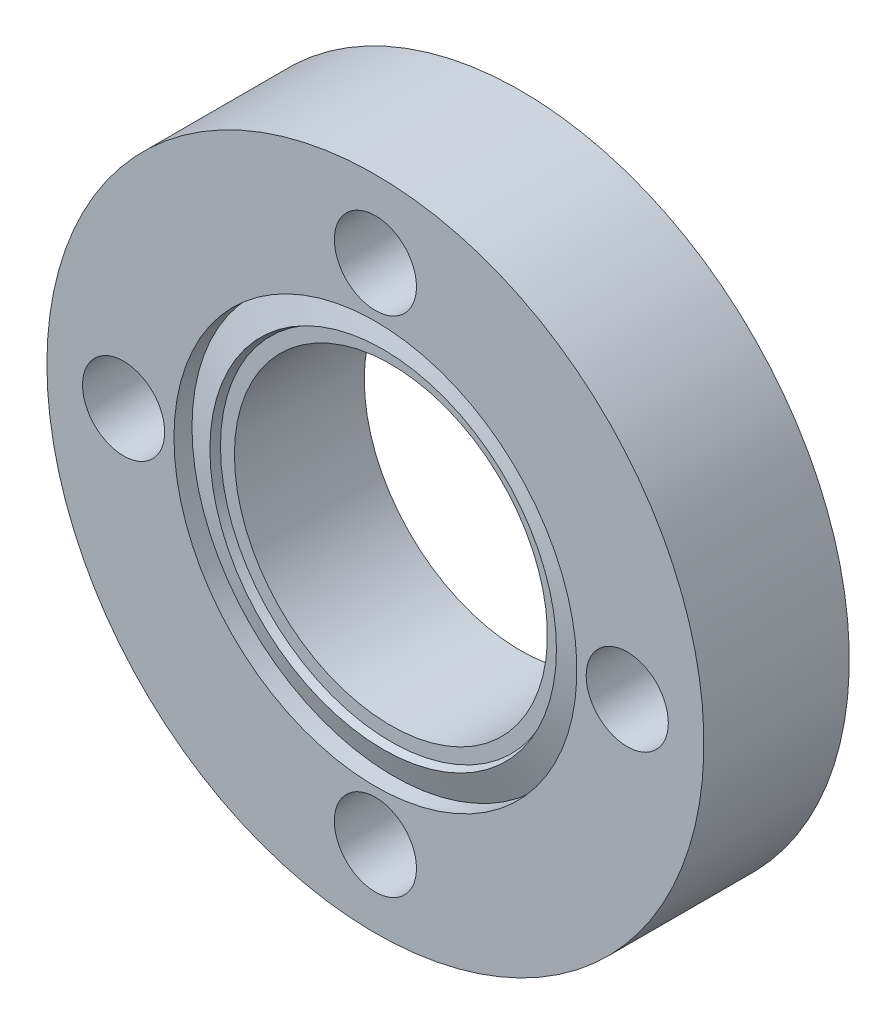
ISO-10303-21;
HEADER;
FILE_DESCRIPTION(('STEP AP214'),'2;1');
FILE_NAME('part.step','',(''),(''),'','','');
FILE_SCHEMA(('AUTOMOTIVE_DESIGN { 1 0 10303 214 1 1 1 1 }'));
ENDSEC;
DATA;
#1=APPLICATION_CONTEXT('core data for automotive mechanical design processes');
#2=APPLICATION_PROTOCOL_DEFINITION('international standard','automotive_design',2000,#1);
#3=PRODUCT_CONTEXT('',#1,'mechanical');
#4=PRODUCT('Part','Part','',(#3));
#5=PRODUCT_RELATED_PRODUCT_CATEGORY('part','',(#4));
#6=PRODUCT_DEFINITION_FORMATION('','',#4);
#7=PRODUCT_DEFINITION_CONTEXT('part definition',#1,'design');
#8=PRODUCT_DEFINITION('design','',#6,#7);
#9=PRODUCT_DEFINITION_SHAPE('','',#8);
#10=(LENGTH_UNIT() NAMED_UNIT(*) SI_UNIT(.MILLI.,.METRE.));
#11=(NAMED_UNIT(*) PLANE_ANGLE_UNIT() SI_UNIT($,.RADIAN.));
#12=(NAMED_UNIT(*) SI_UNIT($,.STERADIAN.) SOLID_ANGLE_UNIT());
#13=UNCERTAINTY_MEASURE_WITH_UNIT(LENGTH_MEASURE(1.E-05),#10,'distance_accuracy_value','');
#14=(GEOMETRIC_REPRESENTATION_CONTEXT(3) GLOBAL_UNCERTAINTY_ASSIGNED_CONTEXT((#13)) GLOBAL_UNIT_ASSIGNED_CONTEXT((#10,
#11,#12)) REPRESENTATION_CONTEXT('',''));
#15=CARTESIAN_POINT('',(0.,0.,0.));
#16=DIRECTION('',(0.,0.,1.));
#17=DIRECTION('',(1.,0.,0.));
#18=AXIS2_PLACEMENT_3D('',#15,#16,#17);
#19=CARTESIAN_POINT('',(0.,16.51,1.27));
#20=DIRECTION('',(0.,0.,1.));
#21=DIRECTION('',(1.,0.,0.));
#22=AXIS2_PLACEMENT_3D('',#19,#20,#21);
#23=PLANE('',#22);
#24=CARTESIAN_POINT('',(0.,-20.6375,1.27));
#25=DIRECTION('',(0.,0.,1.));
#26=DIRECTION('',(-1.,0.,0.));
#27=AXIS2_PLACEMENT_3D('',#24,#25,#26);
#28=CIRCLE('',#27,3.3655);
#29=CARTESIAN_POINT('',(-3.3655,-20.6375,1.27));
#30=VERTEX_POINT('',#29);
#31=EDGE_CURVE('E74',#30,#30,#28,.F.);
#32=ORIENTED_EDGE('',*,*,#31,.T.);
#33=EDGE_LOOP('',(#32));
#34=FACE_BOUND('',#33,.T.);
#35=CARTESIAN_POINT('',(0.,20.6375,1.27));
#36=DIRECTION('',(0.,0.,1.));
#37=DIRECTION('',(1.,0.,0.));
#38=AXIS2_PLACEMENT_3D('',#35,#36,#37);
#39=CIRCLE('',#38,3.3655);
#40=CARTESIAN_POINT('',(3.3655,20.6375,1.27));
#41=VERTEX_POINT('',#40);
#42=EDGE_CURVE('E62',#41,#41,#39,.F.);
#43=ORIENTED_EDGE('',*,*,#42,.T.);
#44=EDGE_LOOP('',(#43));
#45=FACE_BOUND('',#44,.T.);
#46=CARTESIAN_POINT('',(0.,0.,1.27));
#47=DIRECTION('',(0.,0.,-1.));
#48=DIRECTION('',(-1.,0.,0.));
#49=AXIS2_PLACEMENT_3D('',#46,#47,#48);
#50=CIRCLE('',#49,16.51);
#51=CARTESIAN_POINT('',(-16.51,0.,1.27));
#52=VERTEX_POINT('',#51);
#53=EDGE_CURVE('E59',#52,#52,#50,.T.);
#54=ORIENTED_EDGE('',*,*,#53,.T.);
#55=EDGE_LOOP('',(#54));
#56=FACE_BOUND('',#55,.T.);
#57=CARTESIAN_POINT('',(0.,0.,1.27));
#58=DIRECTION('',(0.,0.,-1.));
#59=DIRECTION('',(-1.,0.,0.));
#60=AXIS2_PLACEMENT_3D('',#57,#58,#59);
#61=CIRCLE('',#60,26.924);
#62=CARTESIAN_POINT('',(-26.924,0.,1.27));
#63=VERTEX_POINT('',#62);
#64=EDGE_CURVE('E10',#63,#63,#61,.T.);
#65=ORIENTED_EDGE('',*,*,#64,.F.);
#66=EDGE_LOOP('',(#65));
#67=FACE_BOUND('',#66,.T.);
#68=CARTESIAN_POINT('',(20.6375,0.,1.27));
#69=DIRECTION('',(0.,0.,1.));
#70=DIRECTION('',(0.,-1.,0.));
#71=AXIS2_PLACEMENT_3D('',#68,#69,#70);
#72=CIRCLE('',#71,3.3655);
#73=CARTESIAN_POINT('',(20.6375,-3.36550000000007,1.27));
#74=VERTEX_POINT('',#73);
#75=EDGE_CURVE('E68',#74,#74,#72,.F.);
#76=ORIENTED_EDGE('',*,*,#75,.T.);
#77=EDGE_LOOP('',(#76));
#78=FACE_BOUND('',#77,.T.);
#79=CARTESIAN_POINT('',(-20.6375,2.16166338391125E-13,1.27));
#80=DIRECTION('',(0.,0.,1.));
#81=DIRECTION('',(0.,1.,0.));
#82=AXIS2_PLACEMENT_3D('',#79,#80,#81);
#83=CIRCLE('',#82,3.3655);
#84=CARTESIAN_POINT('',(-20.6375,3.36550000000022,1.27));
#85=VERTEX_POINT('',#84);
#86=EDGE_CURVE('E80',#85,#85,#83,.F.);
#87=ORIENTED_EDGE('',*,*,#86,.T.);
#88=EDGE_LOOP('',(#87));
#89=FACE_BOUND('',#88,.T.);
#90=ADVANCED_FACE('F31',(#34,#45,#56,#67,#78,#89),#23,.T.);
#91=CARTESIAN_POINT('',(0.,26.924,-10.6426));
#92=DIRECTION('',(0.,0.,-1.));
#93=DIRECTION('',(-1.,0.,0.));
#94=AXIS2_PLACEMENT_3D('',#91,#92,#93);
#95=PLANE('',#94);
#96=CARTESIAN_POINT('',(0.,-20.6375,-10.6426));
#97=DIRECTION('',(0.,0.,-1.));
#98=DIRECTION('',(1.,0.,0.));
#99=AXIS2_PLACEMENT_3D('',#96,#97,#98);
#100=CIRCLE('',#99,3.3655);
#101=CARTESIAN_POINT('',(3.3655,-20.6375,-10.6426));
#102=VERTEX_POINT('',#101);
#103=EDGE_CURVE('E71',#102,#102,#100,.F.);
#104=ORIENTED_EDGE('',*,*,#103,.T.);
#105=EDGE_LOOP('',(#104));
#106=FACE_BOUND('',#105,.T.);
#107=CARTESIAN_POINT('',(0.,20.6375,-10.6426));
#108=DIRECTION('',(0.,0.,-1.));
#109=DIRECTION('',(-1.,0.,0.));
#110=AXIS2_PLACEMENT_3D('',#107,#108,#109);
#111=CIRCLE('',#110,3.3655);
#112=CARTESIAN_POINT('',(-3.3655,20.6375,-10.6426));
#113=VERTEX_POINT('',#112);
#114=EDGE_CURVE('E34',#113,#113,#111,.F.);
#115=ORIENTED_EDGE('',*,*,#114,.T.);
#116=EDGE_LOOP('',(#115));
#117=FACE_BOUND('',#116,.T.);
#118=CARTESIAN_POINT('',(0.,0.,-10.6426));
#119=DIRECTION('',(0.,0.,-1.));
#120=DIRECTION('',(-1.,0.,0.));
#121=AXIS2_PLACEMENT_3D('',#118,#119,#120);
#122=CIRCLE('',#121,26.924);
#123=CARTESIAN_POINT('',(-26.924,0.,-10.6426));
#124=VERTEX_POINT('',#123);
#125=EDGE_CURVE('E38',#124,#124,#122,.T.);
#126=ORIENTED_EDGE('',*,*,#125,.T.);
#127=EDGE_LOOP('',(#126));
#128=FACE_BOUND('',#127,.T.);
#129=CARTESIAN_POINT('',(0.,0.,-10.6426));
#130=DIRECTION('',(0.,0.,-1.));
#131=DIRECTION('',(-1.,0.,0.));
#132=AXIS2_PLACEMENT_3D('',#129,#130,#131);
#133=CIRCLE('',#132,12.827);
#134=CARTESIAN_POINT('',(-12.827,0.,-10.6426));
#135=VERTEX_POINT('',#134);
#136=EDGE_CURVE('E42',#135,#135,#133,.T.);
#137=ORIENTED_EDGE('',*,*,#136,.F.);
#138=EDGE_LOOP('',(#137));
#139=FACE_BOUND('',#138,.T.);
#140=CARTESIAN_POINT('',(20.6375,0.,-10.6426));
#141=DIRECTION('',(0.,0.,-1.));
#142=DIRECTION('',(0.,1.,0.));
#143=AXIS2_PLACEMENT_3D('',#140,#141,#142);
#144=CIRCLE('',#143,3.3655);
#145=CARTESIAN_POINT('',(20.6375,3.36549999999993,-10.6426));
#146=VERTEX_POINT('',#145);
#147=EDGE_CURVE('E65',#146,#146,#144,.F.);
#148=ORIENTED_EDGE('',*,*,#147,.T.);
#149=EDGE_LOOP('',(#148));
#150=FACE_BOUND('',#149,.T.);
#151=CARTESIAN_POINT('',(-20.6375,2.16166338391125E-13,-10.6426));
#152=DIRECTION('',(0.,0.,-1.));
#153=DIRECTION('',(0.,-1.,0.));
#154=AXIS2_PLACEMENT_3D('',#151,#152,#153);
#155=CIRCLE('',#154,3.3655);
#156=CARTESIAN_POINT('',(-20.6375,-3.36549999999978,-10.6426));
#157=VERTEX_POINT('',#156);
#158=EDGE_CURVE('E77',#157,#157,#155,.F.);
#159=ORIENTED_EDGE('',*,*,#158,.T.);
#160=EDGE_LOOP('',(#159));
#161=FACE_BOUND('',#160,.T.);
#162=ADVANCED_FACE('F92',(#106,#117,#128,#139,#150,#161),#95,.T.);
#163=CARTESIAN_POINT('',(0.,0.,0.));
#164=DIRECTION('',(0.,0.,-1.));
#165=DIRECTION('',(-1.,0.,0.));
#166=AXIS2_PLACEMENT_3D('',#163,#164,#165);
#167=CYLINDRICAL_SURFACE('',#166,26.924);
#168=ORIENTED_EDGE('',*,*,#64,.T.);
#169=EDGE_LOOP('',(#168));
#170=FACE_BOUND('',#169,.T.);
#171=ORIENTED_EDGE('',*,*,#125,.F.);
#172=EDGE_LOOP('',(#171));
#173=FACE_BOUND('',#172,.T.);
#174=ADVANCED_FACE('F94',(#170,#173),#167,.T.);
#175=CARTESIAN_POINT('',(0.,0.,0.));
#176=DIRECTION('',(0.,0.,-1.));
#177=DIRECTION('',(-1.,0.,0.));
#178=AXIS2_PLACEMENT_3D('',#175,#176,#177);
#179=CYLINDRICAL_SURFACE('',#178,12.827);
#180=ORIENTED_EDGE('',*,*,#136,.T.);
#181=EDGE_LOOP('',(#180));
#182=FACE_BOUND('',#181,.T.);
#183=CARTESIAN_POINT('',(0.,0.,0.));
#184=DIRECTION('',(0.,0.,-1.));
#185=DIRECTION('',(-1.,0.,0.));
#186=AXIS2_PLACEMENT_3D('',#183,#184,#185);
#187=CIRCLE('',#186,12.827);
#188=CARTESIAN_POINT('',(-12.827,0.,0.));
#189=VERTEX_POINT('',#188);
#190=EDGE_CURVE('E47',#189,#189,#187,.T.);
#191=ORIENTED_EDGE('',*,*,#190,.F.);
#192=EDGE_LOOP('',(#191));
#193=FACE_BOUND('',#192,.T.);
#194=ADVANCED_FACE('F101',(#182,#193),#179,.F.);
#195=CARTESIAN_POINT('',(0.,12.827,0.));
#196=DIRECTION('',(0.,0.,1.));
#197=DIRECTION('',(1.,0.,0.));
#198=AXIS2_PLACEMENT_3D('',#195,#196,#197);
#199=PLANE('',#198);
#200=ORIENTED_EDGE('',*,*,#190,.T.);
#201=EDGE_LOOP('',(#200));
#202=FACE_BOUND('',#201,.T.);
#203=CARTESIAN_POINT('',(0.,0.,0.));
#204=DIRECTION('',(0.,0.,-1.));
#205=DIRECTION('',(-1.,0.,0.));
#206=AXIS2_PLACEMENT_3D('',#203,#204,#205);
#207=CIRCLE('',#206,13.97);
#208=CARTESIAN_POINT('',(-13.97,0.,0.));
#209=VERTEX_POINT('',#208);
#210=EDGE_CURVE('E50',#209,#209,#207,.T.);
#211=ORIENTED_EDGE('',*,*,#210,.F.);
#212=EDGE_LOOP('',(#211));
#213=FACE_BOUND('',#212,.T.);
#214=ADVANCED_FACE('F107',(#202,#213),#199,.T.);
#215=CARTESIAN_POINT('',(0.,0.,0.635));
#216=DIRECTION('',(0.,0.,1.));
#217=DIRECTION('',(1.,0.,0.));
#218=AXIS2_PLACEMENT_3D('',#215,#216,#217);
#219=CONICAL_SURFACE('',#218,14.201121098759,0.349065850398866);
#220=ORIENTED_EDGE('',*,*,#210,.T.);
#221=EDGE_LOOP('',(#220));
#222=FACE_BOUND('',#221,.T.);
#223=CARTESIAN_POINT('',(0.,0.,0.635));
#224=DIRECTION('',(0.,0.,-1.));
#225=DIRECTION('',(-1.,0.,0.));
#226=AXIS2_PLACEMENT_3D('',#223,#224,#225);
#227=CIRCLE('',#226,14.201121098759);
#228=CARTESIAN_POINT('',(-14.201121098759,0.,0.635));
#229=VERTEX_POINT('',#228);
#230=EDGE_CURVE('E53',#229,#229,#227,.T.);
#231=ORIENTED_EDGE('',*,*,#230,.F.);
#232=EDGE_LOOP('',(#231));
#233=FACE_BOUND('',#232,.T.);
#234=ADVANCED_FACE('F111',(#222,#233),#219,.F.);
#235=CARTESIAN_POINT('',(0.,0.,-0.205363194576965));
#236=DIRECTION('',(0.,0.,-1.));
#237=DIRECTION('',(-1.,0.,0.));
#238=AXIS2_PLACEMENT_3D('',#235,#236,#237);
#239=CONICAL_SURFACE('',#238,16.51,1.22173047639603);
#240=ORIENTED_EDGE('',*,*,#230,.T.);
#241=EDGE_LOOP('',(#240));
#242=FACE_BOUND('',#241,.T.);
#243=CARTESIAN_POINT('',(0.,0.,-0.205363194576965));
#244=DIRECTION('',(0.,0.,-1.));
#245=DIRECTION('',(-1.,0.,0.));
#246=AXIS2_PLACEMENT_3D('',#243,#244,#245);
#247=CIRCLE('',#246,16.51);
#248=CARTESIAN_POINT('',(-16.51,0.,-0.205363194576965));
#249=VERTEX_POINT('',#248);
#250=EDGE_CURVE('E56',#249,#249,#247,.T.);
#251=ORIENTED_EDGE('',*,*,#250,.F.);
#252=EDGE_LOOP('',(#251));
#253=FACE_BOUND('',#252,.T.);
#254=ADVANCED_FACE('F115',(#242,#253),#239,.T.);
#255=CARTESIAN_POINT('',(0.,0.,0.));
#256=DIRECTION('',(0.,0.,-1.));
#257=DIRECTION('',(-1.,0.,0.));
#258=AXIS2_PLACEMENT_3D('',#255,#256,#257);
#259=CYLINDRICAL_SURFACE('',#258,16.51);
#260=ORIENTED_EDGE('',*,*,#250,.T.);
#261=EDGE_LOOP('',(#260));
#262=FACE_BOUND('',#261,.T.);
#263=ORIENTED_EDGE('',*,*,#53,.F.);
#264=EDGE_LOOP('',(#263));
#265=FACE_BOUND('',#264,.T.);
#266=ADVANCED_FACE('F119',(#262,#265),#259,.F.);
#267=CARTESIAN_POINT('',(0.,20.6375,19.05));
#268=DIRECTION('',(0.,0.,-1.));
#269=DIRECTION('',(-1.,0.,0.));
#270=AXIS2_PLACEMENT_3D('',#267,#268,#269);
#271=CYLINDRICAL_SURFACE('',#270,3.3655);
#272=ORIENTED_EDGE('',*,*,#42,.F.);
#273=EDGE_LOOP('',(#272));
#274=FACE_BOUND('',#273,.T.);
#275=ORIENTED_EDGE('',*,*,#114,.F.);
#276=EDGE_LOOP('',(#275));
#277=FACE_BOUND('',#276,.T.);
#278=ADVANCED_FACE('F123',(#274,#277),#271,.F.);
#279=CARTESIAN_POINT('',(20.6375,0.,19.05));
#280=DIRECTION('',(0.,0.,-1.));
#281=DIRECTION('',(0.,1.,0.));
#282=AXIS2_PLACEMENT_3D('',#279,#280,#281);
#283=CYLINDRICAL_SURFACE('',#282,3.3655);
#284=ORIENTED_EDGE('',*,*,#75,.F.);
#285=EDGE_LOOP('',(#284));
#286=FACE_BOUND('',#285,.T.);
#287=ORIENTED_EDGE('',*,*,#147,.F.);
#288=EDGE_LOOP('',(#287));
#289=FACE_BOUND('',#288,.T.);
#290=ADVANCED_FACE('F127',(#286,#289),#283,.F.);
#291=CARTESIAN_POINT('',(0.,-20.6375,19.05));
#292=DIRECTION('',(0.,0.,-1.));
#293=DIRECTION('',(1.,0.,0.));
#294=AXIS2_PLACEMENT_3D('',#291,#292,#293);
#295=CYLINDRICAL_SURFACE('',#294,3.3655);
#296=ORIENTED_EDGE('',*,*,#31,.F.);
#297=EDGE_LOOP('',(#296));
#298=FACE_BOUND('',#297,.T.);
#299=ORIENTED_EDGE('',*,*,#103,.F.);
#300=EDGE_LOOP('',(#299));
#301=FACE_BOUND('',#300,.T.);
#302=ADVANCED_FACE('F88',(#298,#301),#295,.F.);
#303=CARTESIAN_POINT('',(-20.6375,2.16166338391125E-13,19.05));
#304=DIRECTION('',(0.,0.,-1.));
#305=DIRECTION('',(0.,-1.,0.));
#306=AXIS2_PLACEMENT_3D('',#303,#304,#305);
#307=CYLINDRICAL_SURFACE('',#306,3.3655);
#308=ORIENTED_EDGE('',*,*,#86,.F.);
#309=EDGE_LOOP('',(#308));
#310=FACE_BOUND('',#309,.T.);
#311=ORIENTED_EDGE('',*,*,#158,.F.);
#312=EDGE_LOOP('',(#311));
#313=FACE_BOUND('',#312,.T.);
#314=ADVANCED_FACE('F85',(#310,#313),#307,.F.);
#315=CLOSED_SHELL('',(#90,#162,#174,#194,#214,#234,#254,#266,#278,#290,#302,#314));
#316=MANIFOLD_SOLID_BREP('B2',#315);
#317=ADVANCED_BREP_SHAPE_REPRESENTATION('',(#18,#316),#14);
#318=SHAPE_DEFINITION_REPRESENTATION(#9,#317);
ENDSEC;
END-ISO-10303-21;
